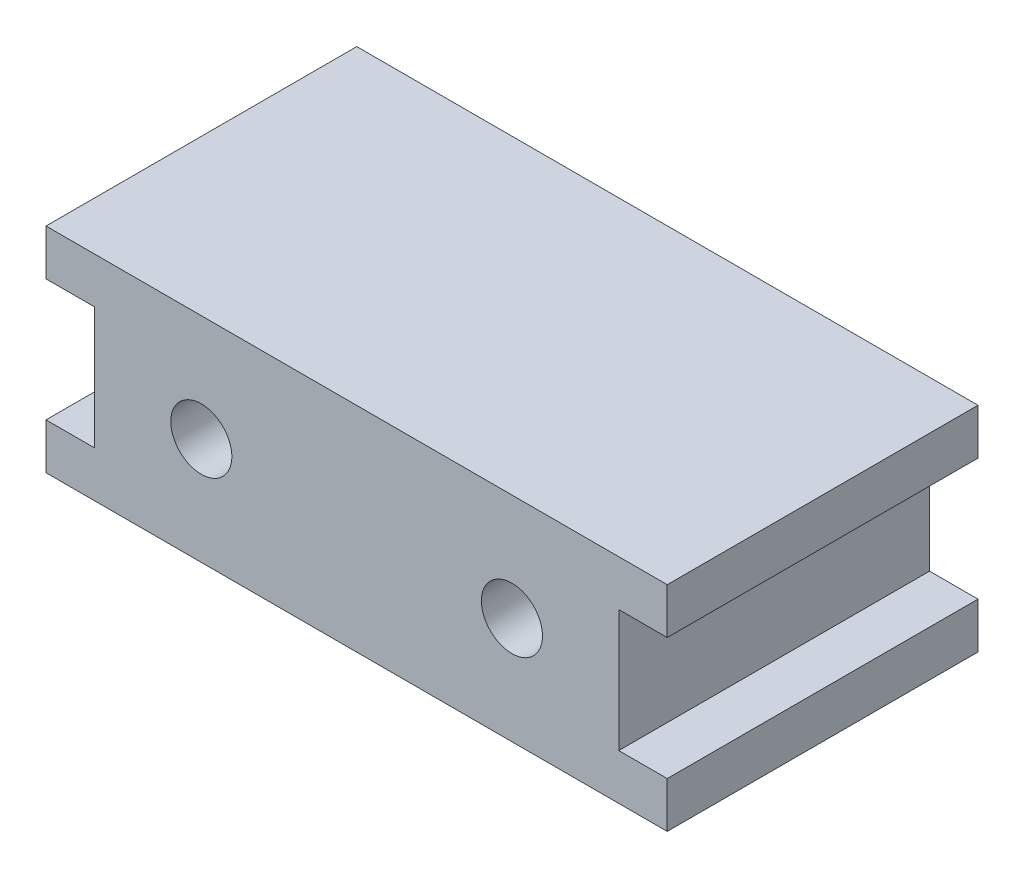
ISO-10303-21;
HEADER;
FILE_DESCRIPTION(('STEP AP214'),'2;1');
FILE_NAME('part.step','',(''),(''),'','','');
FILE_SCHEMA(('AUTOMOTIVE_DESIGN { 1 0 10303 214 1 1 1 1 }'));
ENDSEC;
DATA;
#1=APPLICATION_CONTEXT('core data for automotive mechanical design processes');
#2=APPLICATION_PROTOCOL_DEFINITION('international standard','automotive_design',2000,#1);
#3=PRODUCT_CONTEXT('',#1,'mechanical');
#4=PRODUCT('Part','Part','',(#3));
#5=PRODUCT_RELATED_PRODUCT_CATEGORY('part','',(#4));
#6=PRODUCT_DEFINITION_FORMATION('','',#4);
#7=PRODUCT_DEFINITION_CONTEXT('part definition',#1,'design');
#8=PRODUCT_DEFINITION('design','',#6,#7);
#9=PRODUCT_DEFINITION_SHAPE('','',#8);
#10=(LENGTH_UNIT() NAMED_UNIT(*) SI_UNIT(.MILLI.,.METRE.));
#11=(NAMED_UNIT(*) PLANE_ANGLE_UNIT() SI_UNIT($,.RADIAN.));
#12=(NAMED_UNIT(*) SI_UNIT($,.STERADIAN.) SOLID_ANGLE_UNIT());
#13=UNCERTAINTY_MEASURE_WITH_UNIT(LENGTH_MEASURE(1.E-05),#10,'distance_accuracy_value','');
#14=(GEOMETRIC_REPRESENTATION_CONTEXT(3) GLOBAL_UNCERTAINTY_ASSIGNED_CONTEXT((#13)) GLOBAL_UNIT_ASSIGNED_CONTEXT((#10,
#11,#12)) REPRESENTATION_CONTEXT('',''));
#15=CARTESIAN_POINT('',(0.,0.,0.));
#16=DIRECTION('',(0.,0.,1.));
#17=DIRECTION('',(1.,0.,0.));
#18=AXIS2_PLACEMENT_3D('',#15,#16,#17);
#19=CARTESIAN_POINT('',(0.,0.,-40.72));
#20=DIRECTION('',(0.,0.,1.));
#21=DIRECTION('',(1.,0.,0.));
#22=AXIS2_PLACEMENT_3D('',#19,#20,#21);
#23=PLANE('',#22);
#24=CARTESIAN_POINT('',(20.35,4.32250922509226,-40.72));
#25=DIRECTION('',(0.,0.,1.));
#26=DIRECTION('',(1.,0.,0.));
#27=AXIS2_PLACEMENT_3D('',#24,#25,#26);
#28=CIRCLE('',#27,4.);
#29=CARTESIAN_POINT('',(24.35,4.32250922509226,-40.72));
#30=VERTEX_POINT('',#29);
#31=EDGE_CURVE('E452',#30,#30,#28,.T.);
#32=ORIENTED_EDGE('',*,*,#31,.T.);
#33=EDGE_LOOP('',(#32));
#34=FACE_BOUND('',#33,.T.);
#35=DIRECTION('',(0.,-1.,0.));
#36=VECTOR('',#35,1.);
#37=CARTESIAN_POINT('',(-40.7,-3.67749077490774,-40.72));
#38=LINE('',#37,#36);
#39=CARTESIAN_POINT('',(-40.7,-3.67749077490774,-40.72));
#40=VERTEX_POINT('',#39);
#41=CARTESIAN_POINT('',(-40.7,-9.67749077490774,-40.72));
#42=VERTEX_POINT('',#41);
#43=EDGE_CURVE('E266',#40,#42,#38,.T.);
#44=ORIENTED_EDGE('',*,*,#43,.F.);
#45=DIRECTION('',(1.,0.,0.));
#46=VECTOR('',#45,1.);
#47=CARTESIAN_POINT('',(-40.7,-3.67749077490774,-40.72));
#48=LINE('',#47,#46);
#49=CARTESIAN_POINT('',(-34.35,-3.67749077490774,-40.72));
#50=VERTEX_POINT('',#49);
#51=EDGE_CURVE('E227',#40,#50,#48,.T.);
#52=ORIENTED_EDGE('',*,*,#51,.T.);
#53=DIRECTION('',(0.,-1.,0.));
#54=VECTOR('',#53,1.);
#55=CARTESIAN_POINT('',(-34.35,12.3225092250923,-40.72));
#56=LINE('',#55,#54);
#57=CARTESIAN_POINT('',(-34.35,12.3225092250923,-40.72));
#58=VERTEX_POINT('',#57);
#59=EDGE_CURVE('E211',#58,#50,#56,.T.);
#60=ORIENTED_EDGE('',*,*,#59,.F.);
#61=DIRECTION('',(1.,0.,0.));
#62=VECTOR('',#61,1.);
#63=CARTESIAN_POINT('',(-40.7,12.3225092250923,-40.72));
#64=LINE('',#63,#62);
#65=CARTESIAN_POINT('',(-40.7,12.3225092250923,-40.72));
#66=VERTEX_POINT('',#65);
#67=EDGE_CURVE('E225',#66,#58,#64,.T.);
#68=ORIENTED_EDGE('',*,*,#67,.F.);
#69=DIRECTION('',(0.,-1.,0.));
#70=VECTOR('',#69,1.);
#71=CARTESIAN_POINT('',(-40.7,18.3225092250923,-40.72));
#72=LINE('',#71,#70);
#73=CARTESIAN_POINT('',(-40.7,18.3225092250923,-40.72));
#74=VERTEX_POINT('',#73);
#75=EDGE_CURVE('E230',#74,#66,#72,.T.);
#76=ORIENTED_EDGE('',*,*,#75,.F.);
#77=DIRECTION('',(1.,0.,0.));
#78=VECTOR('',#77,1.);
#79=CARTESIAN_POINT('',(-40.7,18.3225092250923,-40.72));
#80=LINE('',#79,#78);
#81=CARTESIAN_POINT('',(40.7,18.3225092250923,-40.72));
#82=VERTEX_POINT('',#81);
#83=EDGE_CURVE('E232',#74,#82,#80,.T.);
#84=ORIENTED_EDGE('',*,*,#83,.T.);
#85=DIRECTION('',(0.,-1.,0.));
#86=VECTOR('',#85,1.);
#87=CARTESIAN_POINT('',(40.7,18.3225092250923,-40.72));
#88=LINE('',#87,#86);
#89=CARTESIAN_POINT('',(40.7,12.3225092250923,-40.72));
#90=VERTEX_POINT('',#89);
#91=EDGE_CURVE('E308',#82,#90,#88,.T.);
#92=ORIENTED_EDGE('',*,*,#91,.T.);
#93=DIRECTION('',(-1.,0.,0.));
#94=VECTOR('',#93,1.);
#95=CARTESIAN_POINT('',(40.7,12.3225092250923,-40.72));
#96=LINE('',#95,#94);
#97=CARTESIAN_POINT('',(34.35,12.3225092250923,-40.72));
#98=VERTEX_POINT('',#97);
#99=EDGE_CURVE('E306',#90,#98,#96,.T.);
#100=ORIENTED_EDGE('',*,*,#99,.T.);
#101=DIRECTION('',(0.,-1.,0.));
#102=VECTOR('',#101,1.);
#103=CARTESIAN_POINT('',(34.35,12.3225092250923,-40.72));
#104=LINE('',#103,#102);
#105=CARTESIAN_POINT('',(34.35,-3.67749077490774,-40.72));
#106=VERTEX_POINT('',#105);
#107=EDGE_CURVE('E304',#98,#106,#104,.T.);
#108=ORIENTED_EDGE('',*,*,#107,.T.);
#109=DIRECTION('',(-1.,0.,0.));
#110=VECTOR('',#109,1.);
#111=CARTESIAN_POINT('',(40.7,-3.67749077490774,-40.72));
#112=LINE('',#111,#110);
#113=CARTESIAN_POINT('',(40.7,-3.67749077490774,-40.72));
#114=VERTEX_POINT('',#113);
#115=EDGE_CURVE('E301',#114,#106,#112,.T.);
#116=ORIENTED_EDGE('',*,*,#115,.F.);
#117=DIRECTION('',(0.,-1.,0.));
#118=VECTOR('',#117,1.);
#119=CARTESIAN_POINT('',(40.7,-3.67749077490774,-40.72));
#120=LINE('',#119,#118);
#121=CARTESIAN_POINT('',(40.7,-9.67749077490774,-40.72));
#122=VERTEX_POINT('',#121);
#123=EDGE_CURVE('E294',#114,#122,#120,.T.);
#124=ORIENTED_EDGE('',*,*,#123,.T.);
#125=DIRECTION('',(1.,0.,0.));
#126=VECTOR('',#125,1.);
#127=CARTESIAN_POINT('',(-40.7,-9.67749077490774,-40.72));
#128=LINE('',#127,#126);
#129=EDGE_CURVE('E292',#42,#122,#128,.T.);
#130=ORIENTED_EDGE('',*,*,#129,.F.);
#131=EDGE_LOOP('',(#44,#52,#60,#68,#76,#84,#92,#100,#108,#116,#124,#130));
#132=FACE_BOUND('',#131,.T.);
#133=CARTESIAN_POINT('',(-20.35,4.32250922509226,-40.72));
#134=DIRECTION('',(0.,0.,-1.));
#135=DIRECTION('',(-1.,0.,0.));
#136=AXIS2_PLACEMENT_3D('',#133,#134,#135);
#137=CIRCLE('',#136,4.);
#138=CARTESIAN_POINT('',(-24.35,4.32250922509226,-40.72));
#139=VERTEX_POINT('',#138);
#140=EDGE_CURVE('E241',#139,#139,#137,.T.);
#141=ORIENTED_EDGE('',*,*,#140,.F.);
#142=EDGE_LOOP('',(#141));
#143=FACE_BOUND('',#142,.T.);
#144=ADVANCED_FACE('F114',(#34,#132,#143),#23,.F.);
#145=CARTESIAN_POINT('',(0.,0.,0.));
#146=DIRECTION('',(0.,0.,1.));
#147=DIRECTION('',(1.,0.,0.));
#148=AXIS2_PLACEMENT_3D('',#145,#146,#147);
#149=PLANE('',#148);
#150=CARTESIAN_POINT('',(20.35,4.32250922509226,0.));
#151=DIRECTION('',(0.,0.,1.));
#152=DIRECTION('',(1.,0.,0.));
#153=AXIS2_PLACEMENT_3D('',#150,#151,#152);
#154=CIRCLE('',#153,4.);
#155=CARTESIAN_POINT('',(24.35,4.32250922509226,0.));
#156=VERTEX_POINT('',#155);
#157=EDGE_CURVE('E455',#156,#156,#154,.T.);
#158=ORIENTED_EDGE('',*,*,#157,.F.);
#159=EDGE_LOOP('',(#158));
#160=FACE_BOUND('',#159,.T.);
#161=DIRECTION('',(0.,-1.,0.));
#162=VECTOR('',#161,1.);
#163=CARTESIAN_POINT('',(-40.7,-3.67749077490774,0.));
#164=LINE('',#163,#162);
#165=CARTESIAN_POINT('',(-40.7,-3.67749077490774,0.));
#166=VERTEX_POINT('',#165);
#167=CARTESIAN_POINT('',(-40.7,-9.67749077490774,0.));
#168=VERTEX_POINT('',#167);
#169=EDGE_CURVE('E237',#166,#168,#164,.T.);
#170=ORIENTED_EDGE('',*,*,#169,.T.);
#171=DIRECTION('',(1.,0.,0.));
#172=VECTOR('',#171,1.);
#173=CARTESIAN_POINT('',(-40.7,-9.67749077490774,0.));
#174=LINE('',#173,#172);
#175=CARTESIAN_POINT('',(40.7,-9.67749077490774,0.));
#176=VERTEX_POINT('',#175);
#177=EDGE_CURVE('E240',#168,#176,#174,.T.);
#178=ORIENTED_EDGE('',*,*,#177,.T.);
#179=DIRECTION('',(0.,-1.,0.));
#180=VECTOR('',#179,1.);
#181=CARTESIAN_POINT('',(40.7,-3.67749077490774,0.));
#182=LINE('',#181,#180);
#183=CARTESIAN_POINT('',(40.7,-3.67749077490774,0.));
#184=VERTEX_POINT('',#183);
#185=EDGE_CURVE('E244',#184,#176,#182,.T.);
#186=ORIENTED_EDGE('',*,*,#185,.F.);
#187=DIRECTION('',(-1.,0.,0.));
#188=VECTOR('',#187,1.);
#189=CARTESIAN_POINT('',(40.7,-3.67749077490774,0.));
#190=LINE('',#189,#188);
#191=CARTESIAN_POINT('',(34.35,-3.67749077490774,0.));
#192=VERTEX_POINT('',#191);
#193=EDGE_CURVE('E247',#184,#192,#190,.T.);
#194=ORIENTED_EDGE('',*,*,#193,.T.);
#195=DIRECTION('',(0.,-1.,0.));
#196=VECTOR('',#195,1.);
#197=CARTESIAN_POINT('',(34.35,12.3225092250923,0.));
#198=LINE('',#197,#196);
#199=CARTESIAN_POINT('',(34.35,12.3225092250923,0.));
#200=VERTEX_POINT('',#199);
#201=EDGE_CURVE('E250',#200,#192,#198,.T.);
#202=ORIENTED_EDGE('',*,*,#201,.F.);
#203=DIRECTION('',(-1.,0.,0.));
#204=VECTOR('',#203,1.);
#205=CARTESIAN_POINT('',(40.7,12.3225092250923,0.));
#206=LINE('',#205,#204);
#207=CARTESIAN_POINT('',(40.7,12.3225092250923,0.));
#208=VERTEX_POINT('',#207);
#209=EDGE_CURVE('E253',#208,#200,#206,.T.);
#210=ORIENTED_EDGE('',*,*,#209,.F.);
#211=DIRECTION('',(0.,-1.,0.));
#212=VECTOR('',#211,1.);
#213=CARTESIAN_POINT('',(40.7,18.3225092250923,0.));
#214=LINE('',#213,#212);
#215=CARTESIAN_POINT('',(40.7,18.3225092250923,0.));
#216=VERTEX_POINT('',#215);
#217=EDGE_CURVE('E255',#216,#208,#214,.T.);
#218=ORIENTED_EDGE('',*,*,#217,.F.);
#219=DIRECTION('',(1.,0.,0.));
#220=VECTOR('',#219,1.);
#221=CARTESIAN_POINT('',(-40.7,18.3225092250923,0.));
#222=LINE('',#221,#220);
#223=CARTESIAN_POINT('',(-40.7,18.3225092250923,0.));
#224=VERTEX_POINT('',#223);
#225=EDGE_CURVE('E257',#224,#216,#222,.T.);
#226=ORIENTED_EDGE('',*,*,#225,.F.);
#227=DIRECTION('',(0.,-1.,0.));
#228=VECTOR('',#227,1.);
#229=CARTESIAN_POINT('',(-40.7,18.3225092250923,0.));
#230=LINE('',#229,#228);
#231=CARTESIAN_POINT('',(-40.7,12.3225092250923,0.));
#232=VERTEX_POINT('',#231);
#233=EDGE_CURVE('E259',#224,#232,#230,.T.);
#234=ORIENTED_EDGE('',*,*,#233,.T.);
#235=DIRECTION('',(1.,0.,0.));
#236=VECTOR('',#235,1.);
#237=CARTESIAN_POINT('',(-40.7,12.3225092250923,0.));
#238=LINE('',#237,#236);
#239=CARTESIAN_POINT('',(-34.35,12.3225092250923,0.));
#240=VERTEX_POINT('',#239);
#241=EDGE_CURVE('E262',#232,#240,#238,.T.);
#242=ORIENTED_EDGE('',*,*,#241,.T.);
#243=DIRECTION('',(0.,-1.,0.));
#244=VECTOR('',#243,1.);
#245=CARTESIAN_POINT('',(-34.35,12.3225092250923,0.));
#246=LINE('',#245,#244);
#247=CARTESIAN_POINT('',(-34.35,-3.67749077490774,0.));
#248=VERTEX_POINT('',#247);
#249=EDGE_CURVE('E213',#240,#248,#246,.T.);
#250=ORIENTED_EDGE('',*,*,#249,.T.);
#251=DIRECTION('',(1.,0.,0.));
#252=VECTOR('',#251,1.);
#253=CARTESIAN_POINT('',(-40.7,-3.67749077490774,0.));
#254=LINE('',#253,#252);
#255=EDGE_CURVE('E265',#166,#248,#254,.T.);
#256=ORIENTED_EDGE('',*,*,#255,.F.);
#257=EDGE_LOOP('',(#170,#178,#186,#194,#202,#210,#218,#226,#234,#242,#250,#256));
#258=FACE_BOUND('',#257,.T.);
#259=CARTESIAN_POINT('',(-20.35,4.32250922509226,0.));
#260=DIRECTION('',(0.,0.,-1.));
#261=DIRECTION('',(-1.,0.,0.));
#262=AXIS2_PLACEMENT_3D('',#259,#260,#261);
#263=CIRCLE('',#262,4.);
#264=CARTESIAN_POINT('',(-24.35,4.32250922509226,0.));
#265=VERTEX_POINT('',#264);
#266=EDGE_CURVE('E297',#265,#265,#263,.T.);
#267=ORIENTED_EDGE('',*,*,#266,.T.);
#268=EDGE_LOOP('',(#267));
#269=FACE_BOUND('',#268,.T.);
#270=ADVANCED_FACE('F289',(#160,#258,#269),#149,.T.);
#271=CARTESIAN_POINT('',(-40.7,-3.67749077490774,-40.72));
#272=DIRECTION('',(-1.,0.,0.));
#273=DIRECTION('',(0.,-1.,0.));
#274=AXIS2_PLACEMENT_3D('',#271,#272,#273);
#275=PLANE('',#274);
#276=ORIENTED_EDGE('',*,*,#169,.F.);
#277=DIRECTION('',(0.,0.,1.));
#278=VECTOR('',#277,1.);
#279=CARTESIAN_POINT('',(-40.7,-3.67749077490774,-40.72));
#280=LINE('',#279,#278);
#281=EDGE_CURVE('E12',#40,#166,#280,.T.);
#282=ORIENTED_EDGE('',*,*,#281,.F.);
#283=ORIENTED_EDGE('',*,*,#43,.T.);
#284=DIRECTION('',(0.,0.,1.));
#285=VECTOR('',#284,1.);
#286=CARTESIAN_POINT('',(-40.7,-9.67749077490774,-40.72));
#287=LINE('',#286,#285);
#288=EDGE_CURVE('E118',#42,#168,#287,.T.);
#289=ORIENTED_EDGE('',*,*,#288,.T.);
#290=EDGE_LOOP('',(#276,#282,#283,#289));
#291=FACE_BOUND('',#290,.T.);
#292=ADVANCED_FACE('F116',(#291),#275,.T.);
#293=CARTESIAN_POINT('',(-40.7,-3.67749077490774,-40.72));
#294=DIRECTION('',(0.,-1.,0.));
#295=DIRECTION('',(1.,0.,0.));
#296=AXIS2_PLACEMENT_3D('',#293,#294,#295);
#297=PLANE('',#296);
#298=ORIENTED_EDGE('',*,*,#255,.T.);
#299=DIRECTION('',(0.,0.,1.));
#300=VECTOR('',#299,1.);
#301=CARTESIAN_POINT('',(-34.35,-3.67749077490774,-40.72));
#302=LINE('',#301,#300);
#303=EDGE_CURVE('E124',#50,#248,#302,.T.);
#304=ORIENTED_EDGE('',*,*,#303,.F.);
#305=ORIENTED_EDGE('',*,*,#51,.F.);
#306=ORIENTED_EDGE('',*,*,#281,.T.);
#307=EDGE_LOOP('',(#298,#304,#305,#306));
#308=FACE_BOUND('',#307,.T.);
#309=ADVANCED_FACE('F291',(#308),#297,.F.);
#310=CARTESIAN_POINT('',(-34.35,12.3225092250923,-40.72));
#311=DIRECTION('',(-1.,0.,0.));
#312=DIRECTION('',(0.,0.,1.));
#313=AXIS2_PLACEMENT_3D('',#310,#311,#312);
#314=PLANE('',#313);
#315=ORIENTED_EDGE('',*,*,#249,.F.);
#316=DIRECTION('',(0.,0.,1.));
#317=VECTOR('',#316,1.);
#318=CARTESIAN_POINT('',(-34.35,12.3225092250923,-40.72));
#319=LINE('',#318,#317);
#320=EDGE_CURVE('E208',#58,#240,#319,.T.);
#321=ORIENTED_EDGE('',*,*,#320,.F.);
#322=ORIENTED_EDGE('',*,*,#59,.T.);
#323=ORIENTED_EDGE('',*,*,#303,.T.);
#324=EDGE_LOOP('',(#315,#321,#322,#323));
#325=FACE_BOUND('',#324,.T.);
#326=ADVANCED_FACE('F210',(#325),#314,.T.);
#327=CARTESIAN_POINT('',(-40.7,12.3225092250923,-40.72));
#328=DIRECTION('',(0.,-1.,0.));
#329=DIRECTION('',(0.,0.,-1.));
#330=AXIS2_PLACEMENT_3D('',#327,#328,#329);
#331=PLANE('',#330);
#332=ORIENTED_EDGE('',*,*,#241,.F.);
#333=DIRECTION('',(0.,0.,1.));
#334=VECTOR('',#333,1.);
#335=CARTESIAN_POINT('',(-40.7,12.3225092250923,-40.72));
#336=LINE('',#335,#334);
#337=EDGE_CURVE('E218',#66,#232,#336,.T.);
#338=ORIENTED_EDGE('',*,*,#337,.F.);
#339=ORIENTED_EDGE('',*,*,#67,.T.);
#340=ORIENTED_EDGE('',*,*,#320,.T.);
#341=EDGE_LOOP('',(#332,#338,#339,#340));
#342=FACE_BOUND('',#341,.T.);
#343=ADVANCED_FACE('F229',(#342),#331,.T.);
#344=CARTESIAN_POINT('',(-40.7,18.3225092250923,-40.72));
#345=DIRECTION('',(-1.,0.,0.));
#346=DIRECTION('',(0.,0.,1.));
#347=AXIS2_PLACEMENT_3D('',#344,#345,#346);
#348=PLANE('',#347);
#349=ORIENTED_EDGE('',*,*,#233,.F.);
#350=DIRECTION('',(0.,0.,1.));
#351=VECTOR('',#350,1.);
#352=CARTESIAN_POINT('',(-40.7,18.3225092250923,-40.72));
#353=LINE('',#352,#351);
#354=EDGE_CURVE('E270',#74,#224,#353,.T.);
#355=ORIENTED_EDGE('',*,*,#354,.F.);
#356=ORIENTED_EDGE('',*,*,#75,.T.);
#357=ORIENTED_EDGE('',*,*,#337,.T.);
#358=EDGE_LOOP('',(#349,#355,#356,#357));
#359=FACE_BOUND('',#358,.T.);
#360=ADVANCED_FACE('F338',(#359),#348,.T.);
#361=CARTESIAN_POINT('',(-40.7,18.3225092250923,-40.72));
#362=DIRECTION('',(0.,-1.,0.));
#363=DIRECTION('',(0.,0.,-1.));
#364=AXIS2_PLACEMENT_3D('',#361,#362,#363);
#365=PLANE('',#364);
#366=ORIENTED_EDGE('',*,*,#225,.T.);
#367=DIRECTION('',(0.,0.,1.));
#368=VECTOR('',#367,1.);
#369=CARTESIAN_POINT('',(40.7,18.3225092250923,-40.72));
#370=LINE('',#369,#368);
#371=EDGE_CURVE('E272',#82,#216,#370,.T.);
#372=ORIENTED_EDGE('',*,*,#371,.F.);
#373=ORIENTED_EDGE('',*,*,#83,.F.);
#374=ORIENTED_EDGE('',*,*,#354,.T.);
#375=EDGE_LOOP('',(#366,#372,#373,#374));
#376=FACE_BOUND('',#375,.T.);
#377=ADVANCED_FACE('F314',(#376),#365,.F.);
#378=CARTESIAN_POINT('',(40.7,18.3225092250923,-40.72));
#379=DIRECTION('',(-1.,0.,0.));
#380=DIRECTION('',(0.,0.,1.));
#381=AXIS2_PLACEMENT_3D('',#378,#379,#380);
#382=PLANE('',#381);
#383=ORIENTED_EDGE('',*,*,#217,.T.);
#384=DIRECTION('',(0.,0.,1.));
#385=VECTOR('',#384,1.);
#386=CARTESIAN_POINT('',(40.7,12.3225092250923,-40.72));
#387=LINE('',#386,#385);
#388=EDGE_CURVE('E275',#90,#208,#387,.T.);
#389=ORIENTED_EDGE('',*,*,#388,.F.);
#390=ORIENTED_EDGE('',*,*,#91,.F.);
#391=ORIENTED_EDGE('',*,*,#371,.T.);
#392=EDGE_LOOP('',(#383,#389,#390,#391));
#393=FACE_BOUND('',#392,.T.);
#394=ADVANCED_FACE('F318',(#393),#382,.F.);
#395=CARTESIAN_POINT('',(40.7,12.3225092250923,-40.72));
#396=DIRECTION('',(0.,1.,0.));
#397=DIRECTION('',(0.,0.,1.));
#398=AXIS2_PLACEMENT_3D('',#395,#396,#397);
#399=PLANE('',#398);
#400=ORIENTED_EDGE('',*,*,#209,.T.);
#401=DIRECTION('',(0.,0.,1.));
#402=VECTOR('',#401,1.);
#403=CARTESIAN_POINT('',(34.35,12.3225092250923,-40.72));
#404=LINE('',#403,#402);
#405=EDGE_CURVE('E278',#98,#200,#404,.T.);
#406=ORIENTED_EDGE('',*,*,#405,.F.);
#407=ORIENTED_EDGE('',*,*,#99,.F.);
#408=ORIENTED_EDGE('',*,*,#388,.T.);
#409=EDGE_LOOP('',(#400,#406,#407,#408));
#410=FACE_BOUND('',#409,.T.);
#411=ADVANCED_FACE('F323',(#410),#399,.F.);
#412=CARTESIAN_POINT('',(34.35,12.3225092250923,-40.72));
#413=DIRECTION('',(-1.,0.,0.));
#414=DIRECTION('',(0.,0.,1.));
#415=AXIS2_PLACEMENT_3D('',#412,#413,#414);
#416=PLANE('',#415);
#417=ORIENTED_EDGE('',*,*,#201,.T.);
#418=DIRECTION('',(0.,0.,1.));
#419=VECTOR('',#418,1.);
#420=CARTESIAN_POINT('',(34.35,-3.67749077490774,-40.72));
#421=LINE('',#420,#419);
#422=EDGE_CURVE('E281',#106,#192,#421,.T.);
#423=ORIENTED_EDGE('',*,*,#422,.F.);
#424=ORIENTED_EDGE('',*,*,#107,.F.);
#425=ORIENTED_EDGE('',*,*,#405,.T.);
#426=EDGE_LOOP('',(#417,#423,#424,#425));
#427=FACE_BOUND('',#426,.T.);
#428=ADVANCED_FACE('F328',(#427),#416,.F.);
#429=CARTESIAN_POINT('',(40.7,-3.67749077490774,-40.72));
#430=DIRECTION('',(0.,1.,0.));
#431=DIRECTION('',(-1.,0.,0.));
#432=AXIS2_PLACEMENT_3D('',#429,#430,#431);
#433=PLANE('',#432);
#434=ORIENTED_EDGE('',*,*,#193,.F.);
#435=DIRECTION('',(0.,0.,1.));
#436=VECTOR('',#435,1.);
#437=CARTESIAN_POINT('',(40.7,-3.67749077490774,-40.72));
#438=LINE('',#437,#436);
#439=EDGE_CURVE('E283',#114,#184,#438,.T.);
#440=ORIENTED_EDGE('',*,*,#439,.F.);
#441=ORIENTED_EDGE('',*,*,#115,.T.);
#442=ORIENTED_EDGE('',*,*,#422,.T.);
#443=EDGE_LOOP('',(#434,#440,#441,#442));
#444=FACE_BOUND('',#443,.T.);
#445=ADVANCED_FACE('F332',(#444),#433,.T.);
#446=CARTESIAN_POINT('',(40.7,-3.67749077490774,-40.72));
#447=DIRECTION('',(-1.,0.,0.));
#448=DIRECTION('',(0.,-1.,0.));
#449=AXIS2_PLACEMENT_3D('',#446,#447,#448);
#450=PLANE('',#449);
#451=ORIENTED_EDGE('',*,*,#185,.T.);
#452=DIRECTION('',(0.,0.,1.));
#453=VECTOR('',#452,1.);
#454=CARTESIAN_POINT('',(40.7,-9.67749077490774,-40.72));
#455=LINE('',#454,#453);
#456=EDGE_CURVE('E284',#122,#176,#455,.T.);
#457=ORIENTED_EDGE('',*,*,#456,.F.);
#458=ORIENTED_EDGE('',*,*,#123,.F.);
#459=ORIENTED_EDGE('',*,*,#439,.T.);
#460=EDGE_LOOP('',(#451,#457,#458,#459));
#461=FACE_BOUND('',#460,.T.);
#462=ADVANCED_FACE('F335',(#461),#450,.F.);
#463=CARTESIAN_POINT('',(-40.7,-9.67749077490774,-40.72));
#464=DIRECTION('',(0.,-1.,0.));
#465=DIRECTION('',(0.,0.,-1.));
#466=AXIS2_PLACEMENT_3D('',#463,#464,#465);
#467=PLANE('',#466);
#468=ORIENTED_EDGE('',*,*,#177,.F.);
#469=ORIENTED_EDGE('',*,*,#288,.F.);
#470=ORIENTED_EDGE('',*,*,#129,.T.);
#471=ORIENTED_EDGE('',*,*,#456,.T.);
#472=EDGE_LOOP('',(#468,#469,#470,#471));
#473=FACE_BOUND('',#472,.T.);
#474=ADVANCED_FACE('F286',(#473),#467,.T.);
#475=CARTESIAN_POINT('',(-20.35,4.32250922509226,-40.72));
#476=DIRECTION('',(0.,0.,1.));
#477=DIRECTION('',(1.,0.,0.));
#478=AXIS2_PLACEMENT_3D('',#475,#476,#477);
#479=CYLINDRICAL_SURFACE('',#478,4.);
#480=ORIENTED_EDGE('',*,*,#140,.T.);
#481=EDGE_LOOP('',(#480));
#482=FACE_BOUND('',#481,.T.);
#483=ORIENTED_EDGE('',*,*,#266,.F.);
#484=EDGE_LOOP('',(#483));
#485=FACE_BOUND('',#484,.T.);
#486=ADVANCED_FACE('F357',(#482,#485),#479,.F.);
#487=CARTESIAN_POINT('',(20.35,4.32250922509226,-40.72));
#488=DIRECTION('',(0.,0.,1.));
#489=DIRECTION('',(1.,0.,0.));
#490=AXIS2_PLACEMENT_3D('',#487,#488,#489);
#491=CYLINDRICAL_SURFACE('',#490,4.);
#492=ORIENTED_EDGE('',*,*,#31,.F.);
#493=EDGE_LOOP('',(#492));
#494=FACE_BOUND('',#493,.T.);
#495=ORIENTED_EDGE('',*,*,#157,.T.);
#496=EDGE_LOOP('',(#495));
#497=FACE_BOUND('',#496,.T.);
#498=ADVANCED_FACE('F438',(#494,#497),#491,.F.);
#499=CLOSED_SHELL('',(#144,#270,#292,#309,#326,#343,#360,#377,#394,#411,#428,#445,#462,#474,
#486,#498));
#500=MANIFOLD_SOLID_BREP('B2',#499);
#501=ADVANCED_BREP_SHAPE_REPRESENTATION('',(#18,#500),#14);
#502=SHAPE_DEFINITION_REPRESENTATION(#9,#501);
ENDSEC;
END-ISO-10303-21;
